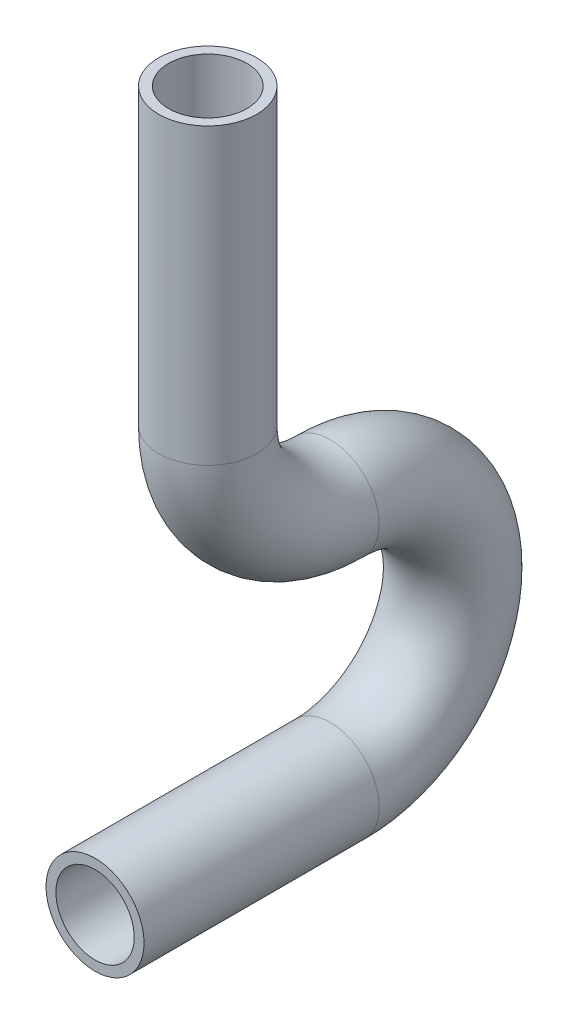
ISO-10303-21;
HEADER;
FILE_DESCRIPTION(('STEP AP214'),'2;1');
FILE_NAME('part.step','',(''),(''),'','','');
FILE_SCHEMA(('AUTOMOTIVE_DESIGN { 1 0 10303 214 1 1 1 1 }'));
ENDSEC;
DATA;
#1=APPLICATION_CONTEXT('core data for automotive mechanical design processes');
#2=APPLICATION_PROTOCOL_DEFINITION('international standard','automotive_design',2000,#1);
#3=PRODUCT_CONTEXT('',#1,'mechanical');
#4=PRODUCT('Part','Part','',(#3));
#5=PRODUCT_RELATED_PRODUCT_CATEGORY('part','',(#4));
#6=PRODUCT_DEFINITION_FORMATION('','',#4);
#7=PRODUCT_DEFINITION_CONTEXT('part definition',#1,'design');
#8=PRODUCT_DEFINITION('design','',#6,#7);
#9=PRODUCT_DEFINITION_SHAPE('','',#8);
#10=(LENGTH_UNIT() NAMED_UNIT(*) SI_UNIT(.MILLI.,.METRE.));
#11=(NAMED_UNIT(*) PLANE_ANGLE_UNIT() SI_UNIT($,.RADIAN.));
#12=(NAMED_UNIT(*) SI_UNIT($,.STERADIAN.) SOLID_ANGLE_UNIT());
#13=UNCERTAINTY_MEASURE_WITH_UNIT(LENGTH_MEASURE(1.E-05),#10,'distance_accuracy_value','');
#14=(GEOMETRIC_REPRESENTATION_CONTEXT(3) GLOBAL_UNCERTAINTY_ASSIGNED_CONTEXT((#13)) GLOBAL_UNIT_ASSIGNED_CONTEXT((#10,
#11,#12)) REPRESENTATION_CONTEXT('',''));
#15=CARTESIAN_POINT('',(0.,0.,0.));
#16=DIRECTION('',(0.,0.,1.));
#17=DIRECTION('',(1.,0.,0.));
#18=AXIS2_PLACEMENT_3D('',#15,#16,#17);
#19=CARTESIAN_POINT('',(-2.49993540865451,0.0174175898246531,-120.));
#20=DIRECTION('',(0.,0.,1.));
#21=DIRECTION('',(1.,0.,0.));
#22=AXIS2_PLACEMENT_3D('',#19,#20,#21);
#23=CYLINDRICAL_SURFACE('',#22,25.);
#24=CARTESIAN_POINT('',(-2.49993540865451,0.0174175898246531,-120.));
#25=DIRECTION('',(0.,0.,1.));
#26=DIRECTION('',(1.,0.,0.));
#27=AXIS2_PLACEMENT_3D('',#24,#25,#26);
#28=CIRCLE('',#27,25.);
#29=CARTESIAN_POINT('',(-2.49993540865451,-24.9825824101753,-120.));
#30=VERTEX_POINT('',#29);
#31=EDGE_CURVE('E10',#30,#30,#28,.T.);
#32=ORIENTED_EDGE('',*,*,#31,.T.);
#33=EDGE_LOOP('',(#32));
#34=FACE_BOUND('',#33,.T.);
#35=CARTESIAN_POINT('',(-2.49993540865451,0.0174175898246531,0.));
#36=DIRECTION('',(0.,0.,1.));
#37=DIRECTION('',(1.,0.,0.));
#38=AXIS2_PLACEMENT_3D('',#35,#36,#37);
#39=CIRCLE('',#38,25.);
#40=CARTESIAN_POINT('',(22.5000645913455,0.0174175898246531,0.));
#41=VERTEX_POINT('',#40);
#42=EDGE_CURVE('E42',#41,#41,#39,.T.);
#43=ORIENTED_EDGE('',*,*,#42,.F.);
#44=EDGE_LOOP('',(#43));
#45=FACE_BOUND('',#44,.T.);
#46=ADVANCED_FACE('F35',(#34,#45),#23,.T.);
#47=CARTESIAN_POINT('',(-2.49993540865451,0.0174175898246531,0.));
#48=DIRECTION('',(0.,0.,1.));
#49=DIRECTION('',(1.,0.,0.));
#50=AXIS2_PLACEMENT_3D('',#47,#48,#49);
#51=PLANE('',#50);
#52=CARTESIAN_POINT('',(-2.49993540865451,0.0174175898246531,0.));
#53=DIRECTION('',(0.,0.,1.));
#54=DIRECTION('',(1.,0.,0.));
#55=AXIS2_PLACEMENT_3D('',#52,#53,#54);
#56=CIRCLE('',#55,20.);
#57=CARTESIAN_POINT('',(17.5000645913455,0.0174175898246531,0.));
#58=VERTEX_POINT('',#57);
#59=EDGE_CURVE('E52',#58,#58,#56,.T.);
#60=ORIENTED_EDGE('',*,*,#59,.F.);
#61=EDGE_LOOP('',(#60));
#62=FACE_BOUND('',#61,.T.);
#63=ORIENTED_EDGE('',*,*,#42,.T.);
#64=EDGE_LOOP('',(#63));
#65=FACE_BOUND('',#64,.T.);
#66=ADVANCED_FACE('F96',(#62,#65),#51,.T.);
#67=CARTESIAN_POINT('',(-2.49993540865451,0.0174175898246531,-120.));
#68=DIRECTION('',(0.,0.,1.));
#69=DIRECTION('',(1.,0.,0.));
#70=AXIS2_PLACEMENT_3D('',#67,#68,#69);
#71=CYLINDRICAL_SURFACE('',#70,20.);
#72=CARTESIAN_POINT('',(-2.49993540865451,0.0174175898246531,-120.));
#73=DIRECTION('',(0.,0.,1.));
#74=DIRECTION('',(1.,0.,0.));
#75=AXIS2_PLACEMENT_3D('',#72,#73,#74);
#76=CIRCLE('',#75,20.);
#77=CARTESIAN_POINT('',(-2.49993540865451,-19.9825824101754,-120.));
#78=VERTEX_POINT('',#77);
#79=EDGE_CURVE('E47',#78,#78,#76,.T.);
#80=ORIENTED_EDGE('',*,*,#79,.F.);
#81=EDGE_LOOP('',(#80));
#82=FACE_BOUND('',#81,.T.);
#83=ORIENTED_EDGE('',*,*,#59,.T.);
#84=EDGE_LOOP('',(#83));
#85=FACE_BOUND('',#84,.T.);
#86=ADVANCED_FACE('F100',(#82,#85),#71,.F.);
#87=CARTESIAN_POINT('',(-2.49993540865451,62.5174175898247,-120.));
#88=DIRECTION('',(-1.,0.,0.));
#89=DIRECTION('',(0.,0.,1.));
#90=AXIS2_PLACEMENT_3D('',#87,#88,#89);
#91=TOROIDAL_SURFACE('',#90,62.5,20.);
#92=CARTESIAN_POINT('',(-2.49993540865451,125.017417589825,-119.999999999999));
#93=DIRECTION('',(0.,0.,1.));
#94=DIRECTION('',(-1.,0.,0.));
#95=AXIS2_PLACEMENT_3D('',#92,#93,#94);
#96=CIRCLE('',#95,20.);
#97=CARTESIAN_POINT('',(-2.49993540865451,145.017417589825,-119.999999999999));
#98=VERTEX_POINT('',#97);
#99=EDGE_CURVE('E38',#98,#98,#96,.T.);
#100=CARTESIAN_POINT('',(-2.49993540865451,62.5174175898247,-120.));
#101=DIRECTION('',(-1.,0.,0.));
#102=DIRECTION('',(0.,0.,1.));
#103=AXIS2_PLACEMENT_3D('',#100,#101,#102);
#104=CIRCLE('',#103,82.5);
#105=EDGE_CURVE('',#98,#78,#104,.T.);
#106=ORIENTED_EDGE('',*,*,#99,.T.);
#107=ORIENTED_EDGE('',*,*,#79,.T.);
#108=ORIENTED_EDGE('',*,*,#105,.T.);
#109=ORIENTED_EDGE('',*,*,#105,.F.);
#110=EDGE_LOOP('',(#106,#108,#107,#109));
#111=FACE_BOUND('',#110,.T.);
#112=ADVANCED_FACE('F108',(#111),#91,.F.);
#113=CARTESIAN_POINT('',(-2.49993540865451,62.5174175898247,-120.));
#114=DIRECTION('',(-1.,0.,0.));
#115=DIRECTION('',(0.,0.,1.));
#116=AXIS2_PLACEMENT_3D('',#113,#114,#115);
#117=TOROIDAL_SURFACE('',#116,62.5,25.);
#118=CARTESIAN_POINT('',(-2.49993540865451,125.017417589825,-119.999999999999));
#119=DIRECTION('',(0.,0.,1.));
#120=DIRECTION('',(-1.,0.,0.));
#121=AXIS2_PLACEMENT_3D('',#118,#119,#120);
#122=CIRCLE('',#121,25.);
#123=CARTESIAN_POINT('',(-2.49993540865451,150.017417589825,-119.999999999999));
#124=VERTEX_POINT('',#123);
#125=EDGE_CURVE('E50',#124,#124,#122,.T.);
#126=CARTESIAN_POINT('',(-2.49993540865451,62.5174175898247,-120.));
#127=DIRECTION('',(-1.,0.,0.));
#128=DIRECTION('',(0.,0.,1.));
#129=AXIS2_PLACEMENT_3D('',#126,#127,#128);
#130=CIRCLE('',#129,87.5);
#131=EDGE_CURVE('',#124,#30,#130,.T.);
#132=ORIENTED_EDGE('',*,*,#125,.F.);
#133=ORIENTED_EDGE('',*,*,#31,.F.);
#134=ORIENTED_EDGE('',*,*,#131,.T.);
#135=ORIENTED_EDGE('',*,*,#131,.F.);
#136=EDGE_LOOP('',(#132,#134,#133,#135));
#137=FACE_BOUND('',#136,.T.);
#138=ADVANCED_FACE('F113',(#137),#117,.T.);
#139=CARTESIAN_POINT('',(-2.49993540865451,187.517417589825,-120.000000000001));
#140=DIRECTION('',(1.,0.,0.));
#141=DIRECTION('',(0.,0.,-1.));
#142=AXIS2_PLACEMENT_3D('',#139,#140,#141);
#143=TOROIDAL_SURFACE('',#142,62.5,20.0000000000005);
#144=CARTESIAN_POINT('',(-2.49993540865451,187.517417589825,-57.5000000000008));
#145=DIRECTION('',(0.,1.,0.));
#146=DIRECTION('',(0.,0.,1.));
#147=AXIS2_PLACEMENT_3D('',#144,#145,#146);
#148=CIRCLE('',#147,20.);
#149=CARTESIAN_POINT('',(-2.49993540865451,187.517417589825,-37.5000000000008));
#150=VERTEX_POINT('',#149);
#151=EDGE_CURVE('E70',#150,#150,#148,.T.);
#152=ORIENTED_EDGE('',*,*,#151,.T.);
#153=EDGE_LOOP('',(#152));
#154=FACE_BOUND('',#153,.T.);
#155=ORIENTED_EDGE('',*,*,#99,.F.);
#156=EDGE_LOOP('',(#155));
#157=FACE_BOUND('',#156,.T.);
#158=ADVANCED_FACE('F91',(#154,#157),#143,.F.);
#159=CARTESIAN_POINT('',(-2.49993540865451,187.517417589825,-120.000000000001));
#160=DIRECTION('',(1.,0.,0.));
#161=DIRECTION('',(0.,0.,-1.));
#162=AXIS2_PLACEMENT_3D('',#159,#160,#161);
#163=TOROIDAL_SURFACE('',#162,62.5,25.);
#164=CARTESIAN_POINT('',(-2.49993540865451,187.517417589825,-57.5000000000008));
#165=DIRECTION('',(0.,1.,0.));
#166=DIRECTION('',(1.,0.,0.));
#167=AXIS2_PLACEMENT_3D('',#164,#165,#166);
#168=CIRCLE('',#167,25.);
#169=CARTESIAN_POINT('',(22.5000645913455,187.517417589825,-57.5000000000008));
#170=VERTEX_POINT('',#169);
#171=EDGE_CURVE('E58',#170,#170,#168,.T.);
#172=ORIENTED_EDGE('',*,*,#171,.F.);
#173=EDGE_LOOP('',(#172));
#174=FACE_BOUND('',#173,.T.);
#175=ORIENTED_EDGE('',*,*,#125,.T.);
#176=EDGE_LOOP('',(#175));
#177=FACE_BOUND('',#176,.T.);
#178=ADVANCED_FACE('F82',(#174,#177),#163,.T.);
#179=CARTESIAN_POINT('',(-2.49993540865451,337.517417589825,-57.5000000000008));
#180=DIRECTION('',(0.,1.,0.));
#181=DIRECTION('',(0.,0.,1.));
#182=AXIS2_PLACEMENT_3D('',#179,#180,#181);
#183=PLANE('',#182);
#184=CARTESIAN_POINT('',(-2.49993540865451,337.517417589825,-57.5000000000008));
#185=DIRECTION('',(0.,1.,0.));
#186=DIRECTION('',(0.,0.,1.));
#187=AXIS2_PLACEMENT_3D('',#184,#185,#186);
#188=CIRCLE('',#187,25.);
#189=CARTESIAN_POINT('',(-2.49993540865451,337.517417589825,-32.5000000000008));
#190=VERTEX_POINT('',#189);
#191=EDGE_CURVE('E62',#190,#190,#188,.T.);
#192=ORIENTED_EDGE('',*,*,#191,.T.);
#193=EDGE_LOOP('',(#192));
#194=FACE_BOUND('',#193,.T.);
#195=CARTESIAN_POINT('',(-2.49993540865451,337.517417589825,-57.5000000000008));
#196=DIRECTION('',(0.,1.,0.));
#197=DIRECTION('',(0.,0.,1.));
#198=AXIS2_PLACEMENT_3D('',#195,#196,#197);
#199=CIRCLE('',#198,20.);
#200=CARTESIAN_POINT('',(-2.49993540865451,337.517417589825,-37.5000000000008));
#201=VERTEX_POINT('',#200);
#202=EDGE_CURVE('E67',#201,#201,#199,.T.);
#203=ORIENTED_EDGE('',*,*,#202,.F.);
#204=EDGE_LOOP('',(#203));
#205=FACE_BOUND('',#204,.T.);
#206=ADVANCED_FACE('F79',(#194,#205),#183,.T.);
#207=CARTESIAN_POINT('',(-2.49993540865451,337.517417589825,-57.5000000000008));
#208=DIRECTION('',(0.,-1.,0.));
#209=DIRECTION('',(0.,0.,-1.));
#210=AXIS2_PLACEMENT_3D('',#207,#208,#209);
#211=CYLINDRICAL_SURFACE('',#210,25.);
#212=ORIENTED_EDGE('',*,*,#191,.F.);
#213=EDGE_LOOP('',(#212));
#214=FACE_BOUND('',#213,.T.);
#215=ORIENTED_EDGE('',*,*,#171,.T.);
#216=EDGE_LOOP('',(#215));
#217=FACE_BOUND('',#216,.T.);
#218=ADVANCED_FACE('F81',(#214,#217),#211,.T.);
#219=CARTESIAN_POINT('',(-2.49993540865451,337.517417589825,-57.5000000000008));
#220=DIRECTION('',(0.,-1.,0.));
#221=DIRECTION('',(0.,0.,-1.));
#222=AXIS2_PLACEMENT_3D('',#219,#220,#221);
#223=CYLINDRICAL_SURFACE('',#222,20.);
#224=ORIENTED_EDGE('',*,*,#202,.T.);
#225=EDGE_LOOP('',(#224));
#226=FACE_BOUND('',#225,.T.);
#227=ORIENTED_EDGE('',*,*,#151,.F.);
#228=EDGE_LOOP('',(#227));
#229=FACE_BOUND('',#228,.T.);
#230=ADVANCED_FACE('F76',(#226,#229),#223,.F.);
#231=CLOSED_SHELL('',(#46,#66,#86,#112,#138,#158,#178,#206,#218,#230));
#232=MANIFOLD_SOLID_BREP('B2',#231);
#233=ADVANCED_BREP_SHAPE_REPRESENTATION('',(#18,#232),#14);
#234=SHAPE_DEFINITION_REPRESENTATION(#9,#233);
ENDSEC;
END-ISO-10303-21;
